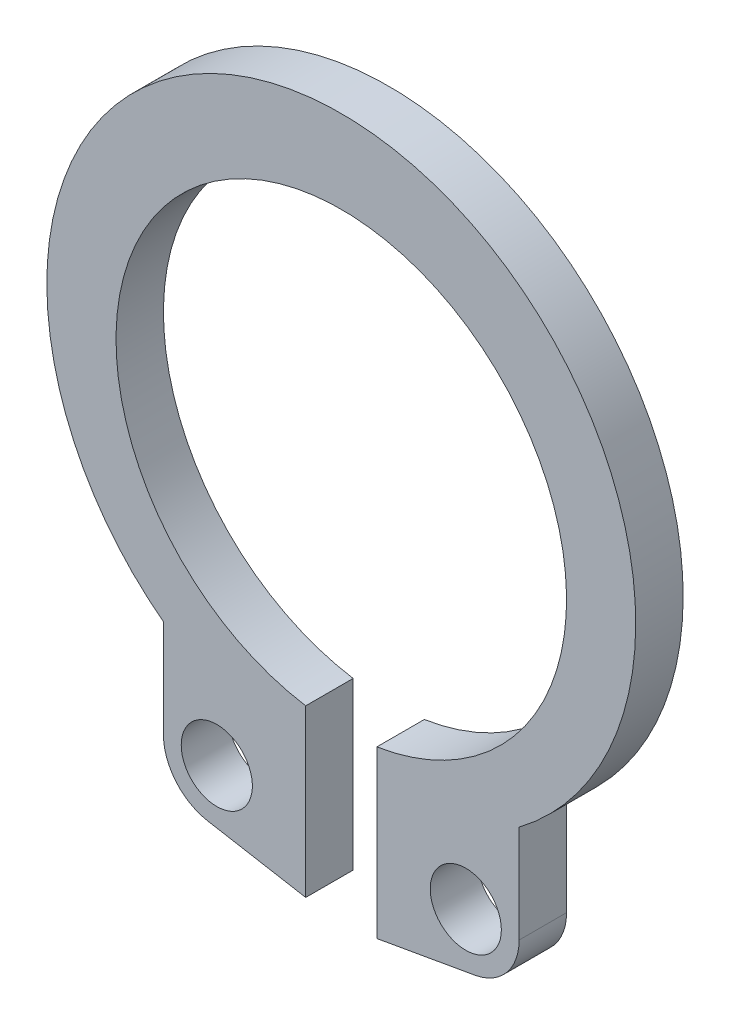
ISO-10303-21;
HEADER;
FILE_DESCRIPTION(('STEP AP214'),'2;1');
FILE_NAME('part.step','',(''),(''),'','','');
FILE_SCHEMA(('AUTOMOTIVE_DESIGN { 1 0 10303 214 1 1 1 1 }'));
ENDSEC;
DATA;
#1=APPLICATION_CONTEXT('core data for automotive mechanical design processes');
#2=APPLICATION_PROTOCOL_DEFINITION('international standard','automotive_design',2000,#1);
#3=PRODUCT_CONTEXT('',#1,'mechanical');
#4=PRODUCT('Part','Part','',(#3));
#5=PRODUCT_RELATED_PRODUCT_CATEGORY('part','',(#4));
#6=PRODUCT_DEFINITION_FORMATION('','',#4);
#7=PRODUCT_DEFINITION_CONTEXT('part definition',#1,'design');
#8=PRODUCT_DEFINITION('design','',#6,#7);
#9=PRODUCT_DEFINITION_SHAPE('','',#8);
#10=(LENGTH_UNIT() NAMED_UNIT(*) SI_UNIT(.MILLI.,.METRE.));
#11=(NAMED_UNIT(*) PLANE_ANGLE_UNIT() SI_UNIT($,.RADIAN.));
#12=(NAMED_UNIT(*) SI_UNIT($,.STERADIAN.) SOLID_ANGLE_UNIT());
#13=UNCERTAINTY_MEASURE_WITH_UNIT(LENGTH_MEASURE(1.E-05),#10,'distance_accuracy_value','');
#14=(GEOMETRIC_REPRESENTATION_CONTEXT(3) GLOBAL_UNCERTAINTY_ASSIGNED_CONTEXT((#13)) GLOBAL_UNIT_ASSIGNED_CONTEXT((#10,
#11,#12)) REPRESENTATION_CONTEXT('',''));
#15=CARTESIAN_POINT('',(0.,0.,0.));
#16=DIRECTION('',(0.,0.,1.));
#17=DIRECTION('',(1.,0.,0.));
#18=AXIS2_PLACEMENT_3D('',#15,#16,#17);
#19=CARTESIAN_POINT('',(0.,0.233333333333333,0.8));
#20=DIRECTION('',(0.,0.,1.));
#21=DIRECTION('',(1.,0.,0.));
#22=AXIS2_PLACEMENT_3D('',#19,#20,#21);
#23=PLANE('',#22);
#24=DIRECTION('',(0.984807753012207,0.173648177666935,0.));
#25=VECTOR('',#24,1.);
#26=CARTESIAN_POINT('',(0.600000000000001,-6.55233260785874,0.8));
#27=LINE('',#26,#25);
#28=CARTESIAN_POINT('',(0.600000000000001,-6.55233260785874,0.8));
#29=VERTEX_POINT('',#28);
#30=CARTESIAN_POINT('',(2.25628335990024,-6.26028516380985,0.8));
#31=VERTEX_POINT('',#30);
#32=EDGE_CURVE('E161',#29,#31,#27,.T.);
#33=ORIENTED_EDGE('',*,*,#32,.T.);
#34=CARTESIAN_POINT('',(2.1,-5.37395818609887,0.8));
#35=DIRECTION('',(0.,0.,1.));
#36=DIRECTION('',(1.,0.,0.));
#37=AXIS2_PLACEMENT_3D('',#34,#35,#36);
#38=CIRCLE('',#37,0.9);
#39=CARTESIAN_POINT('',(3.,-5.37395818609887,0.8));
#40=VERTEX_POINT('',#39);
#41=EDGE_CURVE('E185',#31,#40,#38,.T.);
#42=ORIENTED_EDGE('',*,*,#41,.T.);
#43=DIRECTION('',(0.,-1.,0.));
#44=VECTOR('',#43,1.);
#45=CARTESIAN_POINT('',(3.,-3.72492105184428,0.8));
#46=LINE('',#45,#44);
#47=CARTESIAN_POINT('',(3.,-3.72492105184428,0.8));
#48=VERTEX_POINT('',#47);
#49=EDGE_CURVE('E164',#48,#40,#46,.T.);
#50=ORIENTED_EDGE('',*,*,#49,.F.);
#51=CARTESIAN_POINT('',(0.,0.233333333333333,0.8));
#52=DIRECTION('',(0.,0.,1.));
#53=DIRECTION('',(1.,0.,0.));
#54=AXIS2_PLACEMENT_3D('',#51,#52,#53);
#55=CIRCLE('',#54,4.96666666666667);
#56=CARTESIAN_POINT('',(-3.,-3.72492105184428,0.8));
#57=VERTEX_POINT('',#56);
#58=EDGE_CURVE('E148',#48,#57,#55,.T.);
#59=ORIENTED_EDGE('',*,*,#58,.T.);
#60=DIRECTION('',(0.,-1.,0.));
#61=VECTOR('',#60,1.);
#62=CARTESIAN_POINT('',(-3.,-3.72492105184428,0.8));
#63=LINE('',#62,#61);
#64=CARTESIAN_POINT('',(-3.,-5.37395818609887,0.8));
#65=VERTEX_POINT('',#64);
#66=EDGE_CURVE('E119',#57,#65,#63,.T.);
#67=ORIENTED_EDGE('',*,*,#66,.T.);
#68=CARTESIAN_POINT('',(-2.1,-5.37395818609887,0.8));
#69=DIRECTION('',(0.,0.,1.));
#70=DIRECTION('',(1.,0.,0.));
#71=AXIS2_PLACEMENT_3D('',#68,#69,#70);
#72=CIRCLE('',#71,0.9);
#73=CARTESIAN_POINT('',(-2.25628335990024,-6.26028516380986,0.8));
#74=VERTEX_POINT('',#73);
#75=EDGE_CURVE('E44',#65,#74,#72,.T.);
#76=ORIENTED_EDGE('',*,*,#75,.T.);
#77=DIRECTION('',(0.984807753012207,-0.173648177666934,0.));
#78=VECTOR('',#77,1.);
#79=CARTESIAN_POINT('',(-3.,-6.12914785415842,0.8));
#80=LINE('',#79,#78);
#81=CARTESIAN_POINT('',(-0.599999999999999,-6.55233260785874,0.8));
#82=VERTEX_POINT('',#81);
#83=EDGE_CURVE('E151',#74,#82,#80,.T.);
#84=ORIENTED_EDGE('',*,*,#83,.T.);
#85=DIRECTION('',(0.,-1.,0.));
#86=VECTOR('',#85,1.);
#87=CARTESIAN_POINT('',(-0.599999999999999,-3.75233260785874,0.8));
#88=LINE('',#87,#86);
#89=CARTESIAN_POINT('',(-0.600000000000004,-3.75233260785874,0.8));
#90=VERTEX_POINT('',#89);
#91=EDGE_CURVE('E153',#90,#82,#88,.T.);
#92=ORIENTED_EDGE('',*,*,#91,.F.);
#93=CARTESIAN_POINT('',(0.,0.,0.8));
#94=DIRECTION('',(0.,0.,1.));
#95=DIRECTION('',(1.,0.,0.));
#96=AXIS2_PLACEMENT_3D('',#93,#94,#95);
#97=CIRCLE('',#96,3.8);
#98=CARTESIAN_POINT('',(0.6,-3.75233260785874,0.8));
#99=VERTEX_POINT('',#98);
#100=EDGE_CURVE('E156',#99,#90,#97,.T.);
#101=ORIENTED_EDGE('',*,*,#100,.F.);
#102=DIRECTION('',(0.,-1.,0.));
#103=VECTOR('',#102,1.);
#104=CARTESIAN_POINT('',(0.6,-3.75233260785874,0.8));
#105=LINE('',#104,#103);
#106=EDGE_CURVE('E159',#99,#29,#105,.T.);
#107=ORIENTED_EDGE('',*,*,#106,.T.);
#108=EDGE_LOOP('',(#33,#42,#50,#59,#67,#76,#84,#92,#101,#107));
#109=FACE_BOUND('',#108,.T.);
#110=CARTESIAN_POINT('',(2.1,-5.37395818609887,0.8));
#111=DIRECTION('',(0.,0.,1.));
#112=DIRECTION('',(1.,0.,0.));
#113=AXIS2_PLACEMENT_3D('',#110,#111,#112);
#114=CIRCLE('',#113,0.599999999999999);
#115=CARTESIAN_POINT('',(2.7,-5.37395818609887,0.8));
#116=VERTEX_POINT('',#115);
#117=EDGE_CURVE('E130',#116,#116,#114,.T.);
#118=ORIENTED_EDGE('',*,*,#117,.F.);
#119=EDGE_LOOP('',(#118));
#120=FACE_BOUND('',#119,.T.);
#121=CARTESIAN_POINT('',(-2.1,-5.37395818609887,0.8));
#122=DIRECTION('',(0.,0.,-1.));
#123=DIRECTION('',(-1.,0.,0.));
#124=AXIS2_PLACEMENT_3D('',#121,#122,#123);
#125=CIRCLE('',#124,0.599999999999999);
#126=CARTESIAN_POINT('',(-2.7,-5.37395818609887,0.8));
#127=VERTEX_POINT('',#126);
#128=EDGE_CURVE('E254',#127,#127,#125,.T.);
#129=ORIENTED_EDGE('',*,*,#128,.T.);
#130=EDGE_LOOP('',(#129));
#131=FACE_BOUND('',#130,.T.);
#132=ADVANCED_FACE('F29',(#109,#120,#131),#23,.T.);
#133=CARTESIAN_POINT('',(0.,0.233333333333333,0.));
#134=DIRECTION('',(0.,0.,1.));
#135=DIRECTION('',(1.,0.,0.));
#136=AXIS2_PLACEMENT_3D('',#133,#134,#135);
#137=PLANE('',#136);
#138=DIRECTION('',(0.,-1.,0.));
#139=VECTOR('',#138,1.);
#140=CARTESIAN_POINT('',(3.,-3.72492105184428,0.));
#141=LINE('',#140,#139);
#142=CARTESIAN_POINT('',(3.,-3.72492105184428,0.));
#143=VERTEX_POINT('',#142);
#144=CARTESIAN_POINT('',(3.,-5.37395818609887,0.));
#145=VERTEX_POINT('',#144);
#146=EDGE_CURVE('E146',#143,#145,#141,.T.);
#147=ORIENTED_EDGE('',*,*,#146,.T.);
#148=CARTESIAN_POINT('',(2.1,-5.37395818609887,0.));
#149=DIRECTION('',(0.,0.,1.));
#150=DIRECTION('',(1.,0.,0.));
#151=AXIS2_PLACEMENT_3D('',#148,#149,#150);
#152=CIRCLE('',#151,0.9);
#153=CARTESIAN_POINT('',(2.25628335990024,-6.26028516380985,0.));
#154=VERTEX_POINT('',#153);
#155=EDGE_CURVE('E180',#145,#154,#152,.F.);
#156=ORIENTED_EDGE('',*,*,#155,.T.);
#157=DIRECTION('',(0.984807753012207,0.173648177666935,0.));
#158=VECTOR('',#157,1.);
#159=CARTESIAN_POINT('',(0.600000000000001,-6.55233260785874,0.));
#160=LINE('',#159,#158);
#161=CARTESIAN_POINT('',(0.600000000000001,-6.55233260785874,0.));
#162=VERTEX_POINT('',#161);
#163=EDGE_CURVE('E143',#162,#154,#160,.T.);
#164=ORIENTED_EDGE('',*,*,#163,.F.);
#165=DIRECTION('',(0.,-1.,0.));
#166=VECTOR('',#165,1.);
#167=CARTESIAN_POINT('',(0.6,-3.75233260785874,0.));
#168=LINE('',#167,#166);
#169=CARTESIAN_POINT('',(0.6,-3.75233260785874,0.));
#170=VERTEX_POINT('',#169);
#171=EDGE_CURVE('E141',#170,#162,#168,.T.);
#172=ORIENTED_EDGE('',*,*,#171,.F.);
#173=CARTESIAN_POINT('',(0.,0.,0.));
#174=DIRECTION('',(0.,0.,1.));
#175=DIRECTION('',(1.,0.,0.));
#176=AXIS2_PLACEMENT_3D('',#173,#174,#175);
#177=CIRCLE('',#176,3.8);
#178=CARTESIAN_POINT('',(-0.600000000000004,-3.75233260785874,0.));
#179=VERTEX_POINT('',#178);
#180=EDGE_CURVE('E138',#170,#179,#177,.T.);
#181=ORIENTED_EDGE('',*,*,#180,.T.);
#182=DIRECTION('',(0.,-1.,0.));
#183=VECTOR('',#182,1.);
#184=CARTESIAN_POINT('',(-0.599999999999999,-3.75233260785874,0.));
#185=LINE('',#184,#183);
#186=CARTESIAN_POINT('',(-0.599999999999999,-6.55233260785874,0.));
#187=VERTEX_POINT('',#186);
#188=EDGE_CURVE('E135',#179,#187,#185,.T.);
#189=ORIENTED_EDGE('',*,*,#188,.T.);
#190=DIRECTION('',(0.984807753012207,-0.173648177666934,0.));
#191=VECTOR('',#190,1.);
#192=CARTESIAN_POINT('',(-3.,-6.12914785415842,0.));
#193=LINE('',#192,#191);
#194=CARTESIAN_POINT('',(-2.25628335990024,-6.26028516380986,0.));
#195=VERTEX_POINT('',#194);
#196=EDGE_CURVE('E114',#195,#187,#193,.T.);
#197=ORIENTED_EDGE('',*,*,#196,.F.);
#198=CARTESIAN_POINT('',(-2.1,-5.37395818609887,0.));
#199=DIRECTION('',(0.,0.,1.));
#200=DIRECTION('',(1.,0.,0.));
#201=AXIS2_PLACEMENT_3D('',#198,#199,#200);
#202=CIRCLE('',#201,0.9);
#203=CARTESIAN_POINT('',(-3.,-5.37395818609887,0.));
#204=VERTEX_POINT('',#203);
#205=EDGE_CURVE('E113',#195,#204,#202,.F.);
#206=ORIENTED_EDGE('',*,*,#205,.T.);
#207=DIRECTION('',(0.,-1.,0.));
#208=VECTOR('',#207,1.);
#209=CARTESIAN_POINT('',(-3.,-3.72492105184428,0.));
#210=LINE('',#209,#208);
#211=CARTESIAN_POINT('',(-3.,-3.72492105184428,0.));
#212=VERTEX_POINT('',#211);
#213=EDGE_CURVE('E104',#212,#204,#210,.T.);
#214=ORIENTED_EDGE('',*,*,#213,.F.);
#215=CARTESIAN_POINT('',(0.,0.233333333333333,0.));
#216=DIRECTION('',(0.,0.,1.));
#217=DIRECTION('',(1.,0.,0.));
#218=AXIS2_PLACEMENT_3D('',#215,#216,#217);
#219=CIRCLE('',#218,4.96666666666667);
#220=EDGE_CURVE('E110',#143,#212,#219,.T.);
#221=ORIENTED_EDGE('',*,*,#220,.F.);
#222=EDGE_LOOP('',(#147,#156,#164,#172,#181,#189,#197,#206,#214,#221));
#223=FACE_BOUND('',#222,.T.);
#224=CARTESIAN_POINT('',(2.1,-5.37395818609887,0.));
#225=DIRECTION('',(0.,0.,1.));
#226=DIRECTION('',(1.,0.,0.));
#227=AXIS2_PLACEMENT_3D('',#224,#225,#226);
#228=CIRCLE('',#227,0.599999999999999);
#229=CARTESIAN_POINT('',(2.7,-5.37395818609887,0.));
#230=VERTEX_POINT('',#229);
#231=EDGE_CURVE('E127',#230,#230,#228,.T.);
#232=ORIENTED_EDGE('',*,*,#231,.T.);
#233=EDGE_LOOP('',(#232));
#234=FACE_BOUND('',#233,.T.);
#235=CARTESIAN_POINT('',(-2.1,-5.37395818609887,0.));
#236=DIRECTION('',(0.,0.,-1.));
#237=DIRECTION('',(-1.,0.,0.));
#238=AXIS2_PLACEMENT_3D('',#235,#236,#237);
#239=CIRCLE('',#238,0.599999999999999);
#240=CARTESIAN_POINT('',(-2.7,-5.37395818609887,0.));
#241=VERTEX_POINT('',#240);
#242=EDGE_CURVE('E251',#241,#241,#239,.T.);
#243=ORIENTED_EDGE('',*,*,#242,.F.);
#244=EDGE_LOOP('',(#243));
#245=FACE_BOUND('',#244,.T.);
#246=ADVANCED_FACE('F107',(#223,#234,#245),#137,.F.);
#247=CARTESIAN_POINT('',(0.,0.233333333333333,0.8));
#248=DIRECTION('',(0.,0.,-1.));
#249=DIRECTION('',(-1.,0.,0.));
#250=AXIS2_PLACEMENT_3D('',#247,#248,#249);
#251=CYLINDRICAL_SURFACE('',#250,4.96666666666667);
#252=ORIENTED_EDGE('',*,*,#220,.T.);
#253=DIRECTION('',(0.,0.,-1.));
#254=VECTOR('',#253,1.);
#255=CARTESIAN_POINT('',(-3.,-3.72492105184428,0.8));
#256=LINE('',#255,#254);
#257=EDGE_CURVE('E117',#57,#212,#256,.T.);
#258=ORIENTED_EDGE('',*,*,#257,.F.);
#259=ORIENTED_EDGE('',*,*,#58,.F.);
#260=DIRECTION('',(0.,0.,-1.));
#261=VECTOR('',#260,1.);
#262=CARTESIAN_POINT('',(3.,-3.72492105184428,0.8));
#263=LINE('',#262,#261);
#264=EDGE_CURVE('E126',#48,#143,#263,.T.);
#265=ORIENTED_EDGE('',*,*,#264,.T.);
#266=EDGE_LOOP('',(#252,#258,#259,#265));
#267=FACE_BOUND('',#266,.T.);
#268=ADVANCED_FACE('F31',(#267),#251,.T.);
#269=CARTESIAN_POINT('',(-3.,-3.72492105184428,0.8));
#270=DIRECTION('',(1.,0.,0.));
#271=DIRECTION('',(0.,0.,-1.));
#272=AXIS2_PLACEMENT_3D('',#269,#270,#271);
#273=PLANE('',#272);
#274=ORIENTED_EDGE('',*,*,#213,.T.);
#275=DIRECTION('',(0.,0.,-1.));
#276=VECTOR('',#275,1.);
#277=CARTESIAN_POINT('',(-3.,-5.37395818609887,0.8));
#278=LINE('',#277,#276);
#279=EDGE_CURVE('E11',#204,#65,#278,.F.);
#280=ORIENTED_EDGE('',*,*,#279,.T.);
#281=ORIENTED_EDGE('',*,*,#66,.F.);
#282=ORIENTED_EDGE('',*,*,#257,.T.);
#283=EDGE_LOOP('',(#274,#280,#281,#282));
#284=FACE_BOUND('',#283,.T.);
#285=ADVANCED_FACE('F118',(#284),#273,.F.);
#286=CARTESIAN_POINT('',(-3.,-6.12914785415842,0.8));
#287=DIRECTION('',(0.173648177666934,0.984807753012207,0.));
#288=DIRECTION('',(-0.984807753012207,0.173648177666934,0.));
#289=AXIS2_PLACEMENT_3D('',#286,#287,#288);
#290=PLANE('',#289);
#291=ORIENTED_EDGE('',*,*,#83,.F.);
#292=DIRECTION('',(0.,0.,-1.));
#293=VECTOR('',#292,1.);
#294=CARTESIAN_POINT('',(-2.25628335990024,-6.26028516380986,0.8));
#295=LINE('',#294,#293);
#296=EDGE_CURVE('E37',#74,#195,#295,.T.);
#297=ORIENTED_EDGE('',*,*,#296,.T.);
#298=ORIENTED_EDGE('',*,*,#196,.T.);
#299=DIRECTION('',(0.,0.,-1.));
#300=VECTOR('',#299,1.);
#301=CARTESIAN_POINT('',(-0.599999999999999,-6.55233260785874,0.8));
#302=LINE('',#301,#300);
#303=EDGE_CURVE('E124',#82,#187,#302,.T.);
#304=ORIENTED_EDGE('',*,*,#303,.F.);
#305=EDGE_LOOP('',(#291,#297,#298,#304));
#306=FACE_BOUND('',#305,.T.);
#307=ADVANCED_FACE('F189',(#306),#290,.F.);
#308=CARTESIAN_POINT('',(-0.599999999999999,-3.75233260785874,0.8));
#309=DIRECTION('',(1.,0.,0.));
#310=DIRECTION('',(0.,1.,0.));
#311=AXIS2_PLACEMENT_3D('',#308,#309,#310);
#312=PLANE('',#311);
#313=ORIENTED_EDGE('',*,*,#188,.F.);
#314=DIRECTION('',(0.,0.,-1.));
#315=VECTOR('',#314,1.);
#316=CARTESIAN_POINT('',(-0.600000000000004,-3.75233260785874,0.8));
#317=LINE('',#316,#315);
#318=EDGE_CURVE('E173',#90,#179,#317,.T.);
#319=ORIENTED_EDGE('',*,*,#318,.F.);
#320=ORIENTED_EDGE('',*,*,#91,.T.);
#321=ORIENTED_EDGE('',*,*,#303,.T.);
#322=EDGE_LOOP('',(#313,#319,#320,#321));
#323=FACE_BOUND('',#322,.T.);
#324=ADVANCED_FACE('F196',(#323),#312,.T.);
#325=CARTESIAN_POINT('',(0.,0.,0.8));
#326=DIRECTION('',(0.,0.,-1.));
#327=DIRECTION('',(-1.,0.,0.));
#328=AXIS2_PLACEMENT_3D('',#325,#326,#327);
#329=CYLINDRICAL_SURFACE('',#328,3.8);
#330=ORIENTED_EDGE('',*,*,#180,.F.);
#331=DIRECTION('',(0.,0.,-1.));
#332=VECTOR('',#331,1.);
#333=CARTESIAN_POINT('',(0.6,-3.75233260785874,0.8));
#334=LINE('',#333,#332);
#335=EDGE_CURVE('E171',#99,#170,#334,.T.);
#336=ORIENTED_EDGE('',*,*,#335,.F.);
#337=ORIENTED_EDGE('',*,*,#100,.T.);
#338=ORIENTED_EDGE('',*,*,#318,.T.);
#339=EDGE_LOOP('',(#330,#336,#337,#338));
#340=FACE_BOUND('',#339,.T.);
#341=ADVANCED_FACE('F201',(#340),#329,.F.);
#342=CARTESIAN_POINT('',(0.6,-3.75233260785874,0.8));
#343=DIRECTION('',(1.,0.,0.));
#344=DIRECTION('',(0.,1.,0.));
#345=AXIS2_PLACEMENT_3D('',#342,#343,#344);
#346=PLANE('',#345);
#347=ORIENTED_EDGE('',*,*,#171,.T.);
#348=DIRECTION('',(0.,0.,-1.));
#349=VECTOR('',#348,1.);
#350=CARTESIAN_POINT('',(0.600000000000001,-6.55233260785874,0.8));
#351=LINE('',#350,#349);
#352=EDGE_CURVE('E168',#29,#162,#351,.T.);
#353=ORIENTED_EDGE('',*,*,#352,.F.);
#354=ORIENTED_EDGE('',*,*,#106,.F.);
#355=ORIENTED_EDGE('',*,*,#335,.T.);
#356=EDGE_LOOP('',(#347,#353,#354,#355));
#357=FACE_BOUND('',#356,.T.);
#358=ADVANCED_FACE('F205',(#357),#346,.F.);
#359=CARTESIAN_POINT('',(0.600000000000001,-6.55233260785874,0.8));
#360=DIRECTION('',(-0.173648177666935,0.984807753012207,0.));
#361=DIRECTION('',(-0.984807753012207,-0.173648177666935,0.));
#362=AXIS2_PLACEMENT_3D('',#359,#360,#361);
#363=PLANE('',#362);
#364=ORIENTED_EDGE('',*,*,#163,.T.);
#365=DIRECTION('',(0.,0.,-1.));
#366=VECTOR('',#365,1.);
#367=CARTESIAN_POINT('',(2.25628335990024,-6.26028516380985,0.8));
#368=LINE('',#367,#366);
#369=EDGE_CURVE('E182',#154,#31,#368,.F.);
#370=ORIENTED_EDGE('',*,*,#369,.T.);
#371=ORIENTED_EDGE('',*,*,#32,.F.);
#372=ORIENTED_EDGE('',*,*,#352,.T.);
#373=EDGE_LOOP('',(#364,#370,#371,#372));
#374=FACE_BOUND('',#373,.T.);
#375=ADVANCED_FACE('F217',(#374),#363,.F.);
#376=CARTESIAN_POINT('',(3.,-3.72492105184428,0.8));
#377=DIRECTION('',(1.,0.,0.));
#378=DIRECTION('',(0.,1.,0.));
#379=AXIS2_PLACEMENT_3D('',#376,#377,#378);
#380=PLANE('',#379);
#381=ORIENTED_EDGE('',*,*,#49,.T.);
#382=DIRECTION('',(0.,0.,-1.));
#383=VECTOR('',#382,1.);
#384=CARTESIAN_POINT('',(3.,-5.37395818609887,0.));
#385=LINE('',#384,#383);
#386=EDGE_CURVE('E123',#40,#145,#385,.T.);
#387=ORIENTED_EDGE('',*,*,#386,.T.);
#388=ORIENTED_EDGE('',*,*,#146,.F.);
#389=ORIENTED_EDGE('',*,*,#264,.F.);
#390=EDGE_LOOP('',(#381,#387,#388,#389));
#391=FACE_BOUND('',#390,.T.);
#392=ADVANCED_FACE('F215',(#391),#380,.T.);
#393=CARTESIAN_POINT('',(2.1,-5.37395818609887,0.8));
#394=DIRECTION('',(0.,0.,1.));
#395=DIRECTION('',(1.,0.,0.));
#396=AXIS2_PLACEMENT_3D('',#393,#394,#395);
#397=CYLINDRICAL_SURFACE('',#396,0.9);
#398=ORIENTED_EDGE('',*,*,#41,.F.);
#399=ORIENTED_EDGE('',*,*,#369,.F.);
#400=ORIENTED_EDGE('',*,*,#155,.F.);
#401=ORIENTED_EDGE('',*,*,#386,.F.);
#402=EDGE_LOOP('',(#398,#399,#400,#401));
#403=FACE_BOUND('',#402,.T.);
#404=ADVANCED_FACE('F213',(#403),#397,.T.);
#405=CARTESIAN_POINT('',(-2.1,-5.37395818609887,0.8));
#406=DIRECTION('',(0.,0.,-1.));
#407=DIRECTION('',(-1.,0.,0.));
#408=AXIS2_PLACEMENT_3D('',#405,#406,#407);
#409=CYLINDRICAL_SURFACE('',#408,0.9);
#410=ORIENTED_EDGE('',*,*,#75,.F.);
#411=ORIENTED_EDGE('',*,*,#279,.F.);
#412=ORIENTED_EDGE('',*,*,#205,.F.);
#413=ORIENTED_EDGE('',*,*,#296,.F.);
#414=EDGE_LOOP('',(#410,#411,#412,#413));
#415=FACE_BOUND('',#414,.T.);
#416=ADVANCED_FACE('F237',(#415),#409,.T.);
#417=CARTESIAN_POINT('',(2.1,-5.37395818609887,0.));
#418=DIRECTION('',(0.,0.,1.));
#419=DIRECTION('',(1.,0.,0.));
#420=AXIS2_PLACEMENT_3D('',#417,#418,#419);
#421=CYLINDRICAL_SURFACE('',#420,0.599999999999999);
#422=ORIENTED_EDGE('',*,*,#231,.F.);
#423=EDGE_LOOP('',(#422));
#424=FACE_BOUND('',#423,.T.);
#425=ORIENTED_EDGE('',*,*,#117,.T.);
#426=EDGE_LOOP('',(#425));
#427=FACE_BOUND('',#426,.T.);
#428=ADVANCED_FACE('F240',(#424,#427),#421,.F.);
#429=CARTESIAN_POINT('',(-2.1,-5.37395818609887,0.));
#430=DIRECTION('',(0.,0.,1.));
#431=DIRECTION('',(1.,0.,0.));
#432=AXIS2_PLACEMENT_3D('',#429,#430,#431);
#433=CYLINDRICAL_SURFACE('',#432,0.599999999999999);
#434=ORIENTED_EDGE('',*,*,#242,.T.);
#435=EDGE_LOOP('',(#434));
#436=FACE_BOUND('',#435,.T.);
#437=ORIENTED_EDGE('',*,*,#128,.F.);
#438=EDGE_LOOP('',(#437));
#439=FACE_BOUND('',#438,.T.);
#440=ADVANCED_FACE('F242',(#436,#439),#433,.F.);
#441=CLOSED_SHELL('',(#132,#246,#268,#285,#307,#324,#341,#358,#375,#392,#404,#416,#428,#440));
#442=MANIFOLD_SOLID_BREP('B2',#441);
#443=ADVANCED_BREP_SHAPE_REPRESENTATION('',(#18,#442),#14);
#444=SHAPE_DEFINITION_REPRESENTATION(#9,#443);
ENDSEC;
END-ISO-10303-21;
